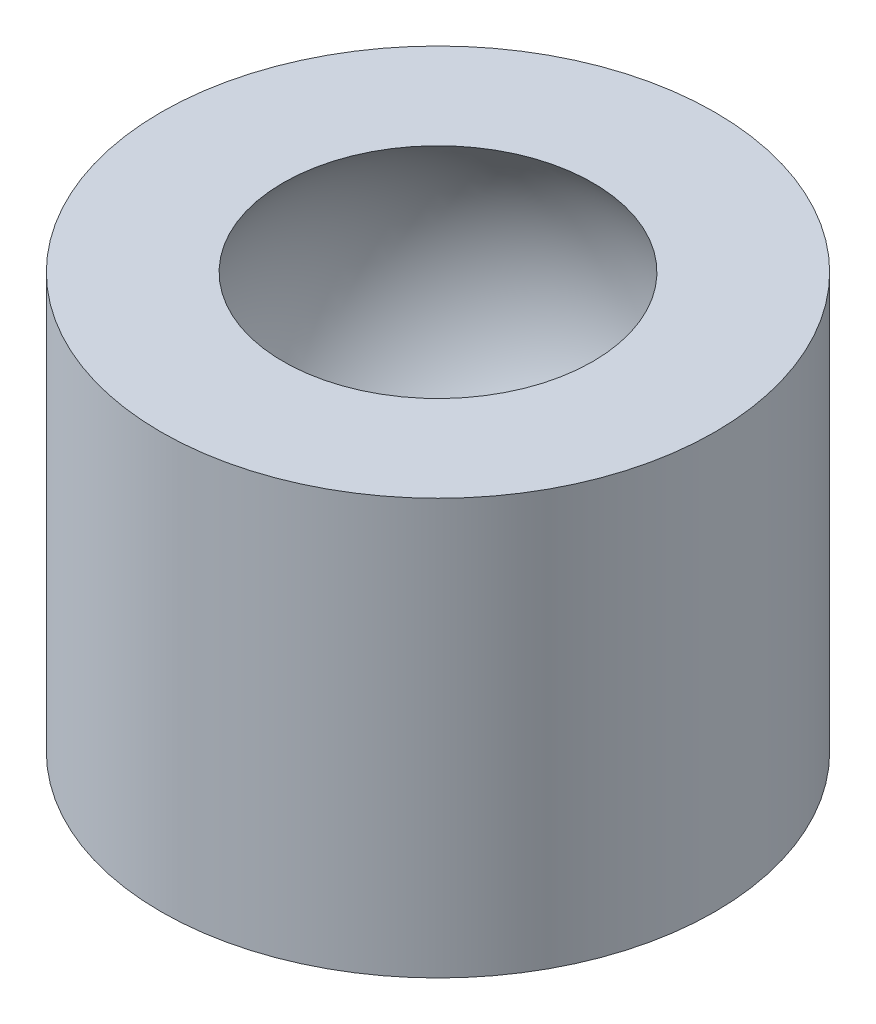
ISO-10303-21;
HEADER;
FILE_DESCRIPTION(('STEP AP214'),'2;1');
FILE_NAME('part.step','',(''),(''),'','','');
FILE_SCHEMA(('AUTOMOTIVE_DESIGN { 1 0 10303 214 1 1 1 1 }'));
ENDSEC;
DATA;
#1=APPLICATION_CONTEXT('core data for automotive mechanical design processes');
#2=APPLICATION_PROTOCOL_DEFINITION('international standard','automotive_design',2000,#1);
#3=PRODUCT_CONTEXT('',#1,'mechanical');
#4=PRODUCT('Part','Part','',(#3));
#5=PRODUCT_RELATED_PRODUCT_CATEGORY('part','',(#4));
#6=PRODUCT_DEFINITION_FORMATION('','',#4);
#7=PRODUCT_DEFINITION_CONTEXT('part definition',#1,'design');
#8=PRODUCT_DEFINITION('design','',#6,#7);
#9=PRODUCT_DEFINITION_SHAPE('','',#8);
#10=(LENGTH_UNIT() NAMED_UNIT(*) SI_UNIT(.MILLI.,.METRE.));
#11=(NAMED_UNIT(*) PLANE_ANGLE_UNIT() SI_UNIT($,.RADIAN.));
#12=(NAMED_UNIT(*) SI_UNIT($,.STERADIAN.) SOLID_ANGLE_UNIT());
#13=UNCERTAINTY_MEASURE_WITH_UNIT(LENGTH_MEASURE(1.E-05),#10,'distance_accuracy_value','');
#14=(GEOMETRIC_REPRESENTATION_CONTEXT(3) GLOBAL_UNCERTAINTY_ASSIGNED_CONTEXT((#13)) GLOBAL_UNIT_ASSIGNED_CONTEXT((#10,
#11,#12)) REPRESENTATION_CONTEXT('',''));
#15=CARTESIAN_POINT('',(0.,0.,0.));
#16=DIRECTION('',(0.,0.,1.));
#17=DIRECTION('',(1.,0.,0.));
#18=AXIS2_PLACEMENT_3D('',#15,#16,#17);
#19=CARTESIAN_POINT('',(0.,20.,0.));
#20=DIRECTION('',(0.,-1.,0.));
#21=DIRECTION('',(-1.,0.,0.));
#22=AXIS2_PLACEMENT_3D('',#19,#20,#21);
#23=SPHERICAL_SURFACE('',#22,15.);
#24=CARTESIAN_POINT('',(0.,30.,0.));
#25=DIRECTION('',(0.,-1.,0.));
#26=DIRECTION('',(1.,0.,0.));
#27=AXIS2_PLACEMENT_3D('',#24,#25,#26);
#28=CIRCLE('',#27,11.1803398874989);
#29=CARTESIAN_POINT('',(11.1803398874989,30.,0.));
#30=VERTEX_POINT('',#29);
#31=EDGE_CURVE('E10',#30,#30,#28,.T.);
#32=ORIENTED_EDGE('',*,*,#31,.F.);
#33=EDGE_LOOP('',(#32));
#34=FACE_BOUND('',#33,.T.);
#35=ADVANCED_FACE('F32',(#34),#23,.F.);
#36=CARTESIAN_POINT('',(0.,30.,0.));
#37=DIRECTION('',(0.,-1.,0.));
#38=DIRECTION('',(1.,0.,0.));
#39=AXIS2_PLACEMENT_3D('',#36,#37,#38);
#40=PLANE('',#39);
#41=CARTESIAN_POINT('',(0.,30.,0.));
#42=DIRECTION('',(0.,-1.,0.));
#43=DIRECTION('',(1.,0.,0.));
#44=AXIS2_PLACEMENT_3D('',#41,#42,#43);
#45=CIRCLE('',#44,20.);
#46=CARTESIAN_POINT('',(20.,30.,0.));
#47=VERTEX_POINT('',#46);
#48=EDGE_CURVE('E38',#47,#47,#45,.T.);
#49=ORIENTED_EDGE('',*,*,#48,.F.);
#50=EDGE_LOOP('',(#49));
#51=FACE_BOUND('',#50,.T.);
#52=ORIENTED_EDGE('',*,*,#31,.T.);
#53=EDGE_LOOP('',(#52));
#54=FACE_BOUND('',#53,.T.);
#55=ADVANCED_FACE('F53',(#51,#54),#40,.F.);
#56=CARTESIAN_POINT('',(0.,0.,0.));
#57=DIRECTION('',(0.,-1.,0.));
#58=DIRECTION('',(1.,0.,0.));
#59=AXIS2_PLACEMENT_3D('',#56,#57,#58);
#60=CYLINDRICAL_SURFACE('',#59,20.);
#61=ORIENTED_EDGE('',*,*,#48,.T.);
#62=EDGE_LOOP('',(#61));
#63=FACE_BOUND('',#62,.T.);
#64=CARTESIAN_POINT('',(0.,0.,0.));
#65=DIRECTION('',(0.,-1.,0.));
#66=DIRECTION('',(1.,0.,0.));
#67=AXIS2_PLACEMENT_3D('',#64,#65,#66);
#68=CIRCLE('',#67,20.);
#69=CARTESIAN_POINT('',(20.,0.,0.));
#70=VERTEX_POINT('',#69);
#71=EDGE_CURVE('E42',#70,#70,#68,.T.);
#72=ORIENTED_EDGE('',*,*,#71,.F.);
#73=EDGE_LOOP('',(#72));
#74=FACE_BOUND('',#73,.T.);
#75=ADVANCED_FACE('F51',(#63,#74),#60,.T.);
#76=CARTESIAN_POINT('',(0.,0.,0.));
#77=DIRECTION('',(0.,-1.,0.));
#78=DIRECTION('',(1.,0.,0.));
#79=AXIS2_PLACEMENT_3D('',#76,#77,#78);
#80=PLANE('',#79);
#81=ORIENTED_EDGE('',*,*,#71,.T.);
#82=EDGE_LOOP('',(#81));
#83=FACE_BOUND('',#82,.T.);
#84=ADVANCED_FACE('F49',(#83),#80,.T.);
#85=CLOSED_SHELL('',(#35,#55,#75,#84));
#86=MANIFOLD_SOLID_BREP('B2',#85);
#87=ADVANCED_BREP_SHAPE_REPRESENTATION('',(#18,#86),#14);
#88=SHAPE_DEFINITION_REPRESENTATION(#9,#87);
ENDSEC;
END-ISO-10303-21;
